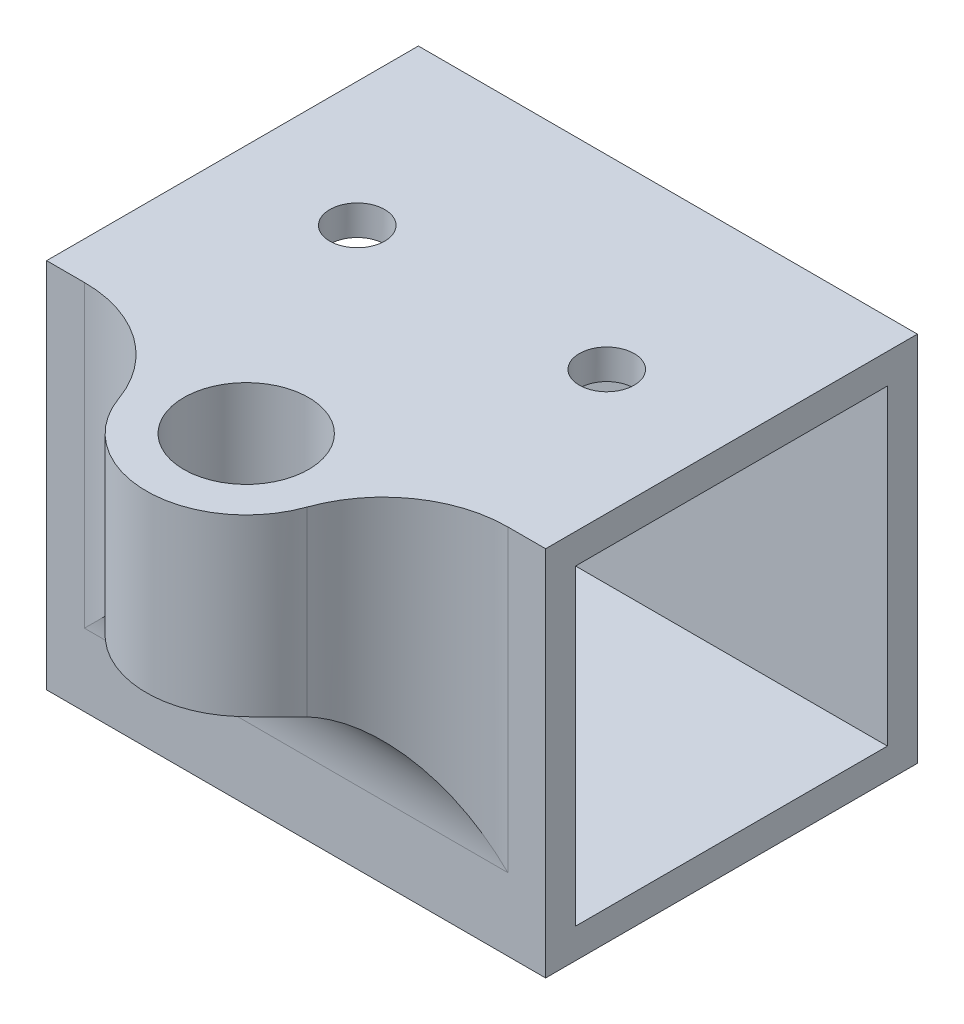
ISO-10303-21;
HEADER;
FILE_DESCRIPTION(('STEP AP214'),'2;1');
FILE_NAME('part.step','',(''),(''),'','','');
FILE_SCHEMA(('AUTOMOTIVE_DESIGN { 1 0 10303 214 1 1 1 1 }'));
ENDSEC;
DATA;
#1=APPLICATION_CONTEXT('core data for automotive mechanical design processes');
#2=APPLICATION_PROTOCOL_DEFINITION('international standard','automotive_design',2000,#1);
#3=PRODUCT_CONTEXT('',#1,'mechanical');
#4=PRODUCT('Part','Part','',(#3));
#5=PRODUCT_RELATED_PRODUCT_CATEGORY('part','',(#4));
#6=PRODUCT_DEFINITION_FORMATION('','',#4);
#7=PRODUCT_DEFINITION_CONTEXT('part definition',#1,'design');
#8=PRODUCT_DEFINITION('design','',#6,#7);
#9=PRODUCT_DEFINITION_SHAPE('','',#8);
#10=(LENGTH_UNIT() NAMED_UNIT(*) SI_UNIT(.MILLI.,.METRE.));
#11=(NAMED_UNIT(*) PLANE_ANGLE_UNIT() SI_UNIT($,.RADIAN.));
#12=(NAMED_UNIT(*) SI_UNIT($,.STERADIAN.) SOLID_ANGLE_UNIT());
#13=UNCERTAINTY_MEASURE_WITH_UNIT(LENGTH_MEASURE(1.E-05),#10,'distance_accuracy_value','');
#14=(GEOMETRIC_REPRESENTATION_CONTEXT(3) GLOBAL_UNCERTAINTY_ASSIGNED_CONTEXT((#13)) GLOBAL_UNIT_ASSIGNED_CONTEXT((#10,
#11,#12)) REPRESENTATION_CONTEXT('',''));
#15=CARTESIAN_POINT('',(0.,0.,0.));
#16=DIRECTION('',(0.,0.,1.));
#17=DIRECTION('',(1.,0.,0.));
#18=AXIS2_PLACEMENT_3D('',#15,#16,#17);
#19=CARTESIAN_POINT('',(40.,0.,14.9));
#20=DIRECTION('',(0.,0.,-1.));
#21=DIRECTION('',(-1.,0.,0.));
#22=AXIS2_PLACEMENT_3D('',#19,#20,#21);
#23=PLANE('',#22);
#24=DIRECTION('',(-1.,0.,0.));
#25=VECTOR('',#24,1.);
#26=CARTESIAN_POINT('',(40.,14.9,14.9));
#27=LINE('',#26,#25);
#28=CARTESIAN_POINT('',(40.,14.9,14.9));
#29=VERTEX_POINT('',#28);
#30=CARTESIAN_POINT('',(36.9705627484771,14.9,14.9));
#31=VERTEX_POINT('',#30);
#32=EDGE_CURVE('E250',#29,#31,#27,.T.);
#33=ORIENTED_EDGE('',*,*,#32,.T.);
#34=DIRECTION('',(0.,1.,0.));
#35=VECTOR('',#34,1.);
#36=CARTESIAN_POINT('',(36.9705627484771,0.,14.9));
#37=LINE('',#36,#35);
#38=CARTESIAN_POINT('',(36.9705627484771,-9.1,14.9));
#39=VERTEX_POINT('',#38);
#40=EDGE_CURVE('E261',#31,#39,#37,.F.);
#41=ORIENTED_EDGE('',*,*,#40,.T.);
#42=DIRECTION('',(-1.,0.,0.));
#43=VECTOR('',#42,1.);
#44=CARTESIAN_POINT('',(40.,-9.1,14.9));
#45=LINE('',#44,#43);
#46=CARTESIAN_POINT('',(3.02943725152286,-9.1,14.9));
#47=VERTEX_POINT('',#46);
#48=EDGE_CURVE('E258',#39,#47,#45,.T.);
#49=ORIENTED_EDGE('',*,*,#48,.T.);
#50=DIRECTION('',(0.,1.,0.));
#51=VECTOR('',#50,1.);
#52=CARTESIAN_POINT('',(3.02943725152286,0.,14.9));
#53=LINE('',#52,#51);
#54=CARTESIAN_POINT('',(3.02943725152286,14.9,14.9));
#55=VERTEX_POINT('',#54);
#56=EDGE_CURVE('E256',#47,#55,#53,.T.);
#57=ORIENTED_EDGE('',*,*,#56,.T.);
#58=CARTESIAN_POINT('',(0.,14.9,14.9));
#59=VERTEX_POINT('',#58);
#60=EDGE_CURVE('E249',#55,#59,#27,.T.);
#61=ORIENTED_EDGE('',*,*,#60,.T.);
#62=DIRECTION('',(0.,-1.,0.));
#63=VECTOR('',#62,1.);
#64=CARTESIAN_POINT('',(0.,0.,14.9));
#65=LINE('',#64,#63);
#66=CARTESIAN_POINT('',(0.,-14.9,14.9));
#67=VERTEX_POINT('',#66);
#68=EDGE_CURVE('E239',#59,#67,#65,.T.);
#69=ORIENTED_EDGE('',*,*,#68,.T.);
#70=DIRECTION('',(-1.,0.,0.));
#71=VECTOR('',#70,1.);
#72=CARTESIAN_POINT('',(40.,-14.9,14.9));
#73=LINE('',#72,#71);
#74=CARTESIAN_POINT('',(40.,-14.9,14.9));
#75=VERTEX_POINT('',#74);
#76=EDGE_CURVE('E246',#75,#67,#73,.T.);
#77=ORIENTED_EDGE('',*,*,#76,.F.);
#78=DIRECTION('',(0.,-1.,0.));
#79=VECTOR('',#78,1.);
#80=CARTESIAN_POINT('',(40.,0.,14.9));
#81=LINE('',#80,#79);
#82=EDGE_CURVE('E229',#29,#75,#81,.T.);
#83=ORIENTED_EDGE('',*,*,#82,.F.);
#84=EDGE_LOOP('',(#33,#41,#49,#57,#61,#69,#77,#83));
#85=FACE_BOUND('',#84,.T.);
#86=ADVANCED_FACE('F59',(#85),#23,.F.);
#87=CARTESIAN_POINT('',(40.,-12.5,12.5));
#88=DIRECTION('',(0.,0.,-1.));
#89=DIRECTION('',(-1.,0.,0.));
#90=AXIS2_PLACEMENT_3D('',#87,#88,#89);
#91=PLANE('',#90);
#92=DIRECTION('',(0.,-1.,0.));
#93=VECTOR('',#92,1.);
#94=CARTESIAN_POINT('',(0.,-12.5,12.5));
#95=LINE('',#94,#93);
#96=CARTESIAN_POINT('',(0.,12.5,12.5));
#97=VERTEX_POINT('',#96);
#98=CARTESIAN_POINT('',(0.,-12.5,12.5));
#99=VERTEX_POINT('',#98);
#100=EDGE_CURVE('E214',#97,#99,#95,.T.);
#101=ORIENTED_EDGE('',*,*,#100,.F.);
#102=DIRECTION('',(-1.,0.,0.));
#103=VECTOR('',#102,1.);
#104=CARTESIAN_POINT('',(40.,12.5,12.5));
#105=LINE('',#104,#103);
#106=CARTESIAN_POINT('',(40.,12.5,12.5));
#107=VERTEX_POINT('',#106);
#108=EDGE_CURVE('E198',#107,#97,#105,.T.);
#109=ORIENTED_EDGE('',*,*,#108,.F.);
#110=DIRECTION('',(0.,-1.,0.));
#111=VECTOR('',#110,1.);
#112=CARTESIAN_POINT('',(40.,-12.5,12.5));
#113=LINE('',#112,#111);
#114=CARTESIAN_POINT('',(40.,-12.5,12.5));
#115=VERTEX_POINT('',#114);
#116=EDGE_CURVE('E203',#107,#115,#113,.T.);
#117=ORIENTED_EDGE('',*,*,#116,.T.);
#118=DIRECTION('',(-1.,0.,0.));
#119=VECTOR('',#118,1.);
#120=CARTESIAN_POINT('',(40.,-12.5,12.5));
#121=LINE('',#120,#119);
#122=EDGE_CURVE('E220',#115,#99,#121,.T.);
#123=ORIENTED_EDGE('',*,*,#122,.T.);
#124=EDGE_LOOP('',(#101,#109,#117,#123));
#125=FACE_BOUND('',#124,.T.);
#126=ADVANCED_FACE('F301',(#125),#91,.T.);
#127=CARTESIAN_POINT('',(40.,0.,0.));
#128=DIRECTION('',(1.,0.,0.));
#129=DIRECTION('',(0.,0.,-1.));
#130=AXIS2_PLACEMENT_3D('',#127,#128,#129);
#131=PLANE('',#130);
#132=DIRECTION('',(0.,1.,0.));
#133=VECTOR('',#132,1.);
#134=CARTESIAN_POINT('',(40.,0.,-14.9));
#135=LINE('',#134,#133);
#136=CARTESIAN_POINT('',(40.,-14.9,-14.9));
#137=VERTEX_POINT('',#136);
#138=CARTESIAN_POINT('',(40.,14.9,-14.9));
#139=VERTEX_POINT('',#138);
#140=EDGE_CURVE('E223',#137,#139,#135,.T.);
#141=ORIENTED_EDGE('',*,*,#140,.T.);
#142=DIRECTION('',(0.,0.,1.));
#143=VECTOR('',#142,1.);
#144=CARTESIAN_POINT('',(40.,14.9,0.));
#145=LINE('',#144,#143);
#146=EDGE_CURVE('E226',#139,#29,#145,.T.);
#147=ORIENTED_EDGE('',*,*,#146,.T.);
#148=ORIENTED_EDGE('',*,*,#82,.T.);
#149=DIRECTION('',(0.,0.,-1.));
#150=VECTOR('',#149,1.);
#151=CARTESIAN_POINT('',(40.,-14.9,0.));
#152=LINE('',#151,#150);
#153=EDGE_CURVE('E231',#75,#137,#152,.T.);
#154=ORIENTED_EDGE('',*,*,#153,.T.);
#155=EDGE_LOOP('',(#141,#147,#148,#154));
#156=FACE_BOUND('',#155,.T.);
#157=DIRECTION('',(0.,0.,1.));
#158=VECTOR('',#157,1.);
#159=CARTESIAN_POINT('',(40.,12.5,12.5));
#160=LINE('',#159,#158);
#161=CARTESIAN_POINT('',(40.,12.5,-12.5));
#162=VERTEX_POINT('',#161);
#163=EDGE_CURVE('E189',#162,#107,#160,.T.);
#164=ORIENTED_EDGE('',*,*,#163,.F.);
#165=DIRECTION('',(0.,1.,0.));
#166=VECTOR('',#165,1.);
#167=CARTESIAN_POINT('',(40.,-12.5,-12.5));
#168=LINE('',#167,#166);
#169=CARTESIAN_POINT('',(40.,-12.5,-12.5));
#170=VERTEX_POINT('',#169);
#171=EDGE_CURVE('E179',#170,#162,#168,.T.);
#172=ORIENTED_EDGE('',*,*,#171,.F.);
#173=DIRECTION('',(0.,0.,-1.));
#174=VECTOR('',#173,1.);
#175=CARTESIAN_POINT('',(40.,-12.5,12.5));
#176=LINE('',#175,#174);
#177=EDGE_CURVE('E205',#115,#170,#176,.T.);
#178=ORIENTED_EDGE('',*,*,#177,.F.);
#179=ORIENTED_EDGE('',*,*,#116,.F.);
#180=EDGE_LOOP('',(#164,#172,#178,#179));
#181=FACE_BOUND('',#180,.T.);
#182=ADVANCED_FACE('F201',(#156,#181),#131,.T.);
#183=CARTESIAN_POINT('',(0.,0.,0.));
#184=DIRECTION('',(1.,0.,0.));
#185=DIRECTION('',(0.,0.,-1.));
#186=AXIS2_PLACEMENT_3D('',#183,#184,#185);
#187=PLANE('',#186);
#188=DIRECTION('',(0.,1.,0.));
#189=VECTOR('',#188,1.);
#190=CARTESIAN_POINT('',(0.,0.,-14.9));
#191=LINE('',#190,#189);
#192=CARTESIAN_POINT('',(0.,-14.9,-14.9));
#193=VERTEX_POINT('',#192);
#194=CARTESIAN_POINT('',(0.,14.9,-14.9));
#195=VERTEX_POINT('',#194);
#196=EDGE_CURVE('E197',#193,#195,#191,.T.);
#197=ORIENTED_EDGE('',*,*,#196,.F.);
#198=DIRECTION('',(0.,0.,-1.));
#199=VECTOR('',#198,1.);
#200=CARTESIAN_POINT('',(0.,-14.9,0.));
#201=LINE('',#200,#199);
#202=EDGE_CURVE('E227',#67,#193,#201,.T.);
#203=ORIENTED_EDGE('',*,*,#202,.F.);
#204=ORIENTED_EDGE('',*,*,#68,.F.);
#205=DIRECTION('',(0.,0.,1.));
#206=VECTOR('',#205,1.);
#207=CARTESIAN_POINT('',(0.,14.9,0.));
#208=LINE('',#207,#206);
#209=EDGE_CURVE('E236',#195,#59,#208,.T.);
#210=ORIENTED_EDGE('',*,*,#209,.F.);
#211=EDGE_LOOP('',(#197,#203,#204,#210));
#212=FACE_BOUND('',#211,.T.);
#213=DIRECTION('',(0.,1.,0.));
#214=VECTOR('',#213,1.);
#215=CARTESIAN_POINT('',(0.,-12.5,-12.5));
#216=LINE('',#215,#214);
#217=CARTESIAN_POINT('',(0.,-12.5,-12.5));
#218=VERTEX_POINT('',#217);
#219=CARTESIAN_POINT('',(0.,12.5,-12.5));
#220=VERTEX_POINT('',#219);
#221=EDGE_CURVE('E210',#218,#220,#216,.T.);
#222=ORIENTED_EDGE('',*,*,#221,.T.);
#223=DIRECTION('',(0.,0.,1.));
#224=VECTOR('',#223,1.);
#225=CARTESIAN_POINT('',(0.,12.5,12.5));
#226=LINE('',#225,#224);
#227=EDGE_CURVE('E196',#220,#97,#226,.T.);
#228=ORIENTED_EDGE('',*,*,#227,.T.);
#229=ORIENTED_EDGE('',*,*,#100,.T.);
#230=DIRECTION('',(0.,0.,-1.));
#231=VECTOR('',#230,1.);
#232=CARTESIAN_POINT('',(0.,-12.5,12.5));
#233=LINE('',#232,#231);
#234=EDGE_CURVE('E190',#99,#218,#233,.T.);
#235=ORIENTED_EDGE('',*,*,#234,.T.);
#236=EDGE_LOOP('',(#222,#228,#229,#235));
#237=FACE_BOUND('',#236,.T.);
#238=ADVANCED_FACE('F313',(#212,#237),#187,.F.);
#239=CARTESIAN_POINT('',(40.,0.,-14.9));
#240=DIRECTION('',(0.,0.,1.));
#241=DIRECTION('',(1.,0.,0.));
#242=AXIS2_PLACEMENT_3D('',#239,#240,#241);
#243=PLANE('',#242);
#244=DIRECTION('',(-1.,0.,0.));
#245=VECTOR('',#244,1.);
#246=CARTESIAN_POINT('',(40.,-14.9,-14.9));
#247=LINE('',#246,#245);
#248=CARTESIAN_POINT('',(31.1910678668302,-14.9,-14.9));
#249=VERTEX_POINT('',#248);
#250=EDGE_CURVE('E243',#137,#249,#247,.T.);
#251=ORIENTED_EDGE('',*,*,#250,.T.);
#252=DIRECTION('',(0.,-1.,0.));
#253=VECTOR('',#252,1.);
#254=CARTESIAN_POINT('',(31.1910678668302,0.,-14.9));
#255=LINE('',#254,#253);
#256=CARTESIAN_POINT('',(31.1910678668302,-10.9,-14.9));
#257=VERTEX_POINT('',#256);
#258=EDGE_CURVE('E337',#249,#257,#255,.F.);
#259=ORIENTED_EDGE('',*,*,#258,.T.);
#260=DIRECTION('',(1.,0.,0.));
#261=VECTOR('',#260,1.);
#262=CARTESIAN_POINT('',(40.,-10.9,-14.9));
#263=LINE('',#262,#261);
#264=CARTESIAN_POINT('',(8.80893213316978,-10.9,-14.9));
#265=VERTEX_POINT('',#264);
#266=EDGE_CURVE('E351',#265,#257,#263,.T.);
#267=ORIENTED_EDGE('',*,*,#266,.F.);
#268=DIRECTION('',(0.,-1.,0.));
#269=VECTOR('',#268,1.);
#270=CARTESIAN_POINT('',(8.80893213316978,0.,-14.9));
#271=LINE('',#270,#269);
#272=CARTESIAN_POINT('',(8.80893213316978,-14.9,-14.9));
#273=VERTEX_POINT('',#272);
#274=EDGE_CURVE('E347',#265,#273,#271,.T.);
#275=ORIENTED_EDGE('',*,*,#274,.T.);
#276=EDGE_CURVE('E233',#273,#193,#247,.T.);
#277=ORIENTED_EDGE('',*,*,#276,.T.);
#278=ORIENTED_EDGE('',*,*,#196,.T.);
#279=DIRECTION('',(-1.,0.,0.));
#280=VECTOR('',#279,1.);
#281=CARTESIAN_POINT('',(40.,14.9,-14.9));
#282=LINE('',#281,#280);
#283=EDGE_CURVE('E253',#139,#195,#282,.T.);
#284=ORIENTED_EDGE('',*,*,#283,.F.);
#285=ORIENTED_EDGE('',*,*,#140,.F.);
#286=EDGE_LOOP('',(#251,#259,#267,#275,#277,#278,#284,#285));
#287=FACE_BOUND('',#286,.T.);
#288=ADVANCED_FACE('F317',(#287),#243,.F.);
#289=CARTESIAN_POINT('',(40.,14.9,0.));
#290=DIRECTION('',(0.,-1.,0.));
#291=DIRECTION('',(0.,0.,-1.));
#292=AXIS2_PLACEMENT_3D('',#289,#290,#291);
#293=PLANE('',#292);
#294=CARTESIAN_POINT('',(10.,14.9,0.));
#295=DIRECTION('',(0.,1.,0.));
#296=DIRECTION('',(0.,0.,1.));
#297=AXIS2_PLACEMENT_3D('',#294,#295,#296);
#298=CIRCLE('',#297,2.2);
#299=CARTESIAN_POINT('',(10.,14.9,2.2));
#300=VERTEX_POINT('',#299);
#301=EDGE_CURVE('E373',#300,#300,#298,.T.);
#302=ORIENTED_EDGE('',*,*,#301,.F.);
#303=EDGE_LOOP('',(#302));
#304=FACE_BOUND('',#303,.T.);
#305=CARTESIAN_POINT('',(30.,14.9,0.));
#306=DIRECTION('',(0.,1.,0.));
#307=DIRECTION('',(0.,0.,1.));
#308=AXIS2_PLACEMENT_3D('',#305,#306,#307);
#309=CIRCLE('',#308,2.2);
#310=CARTESIAN_POINT('',(30.,14.9,2.2));
#311=VERTEX_POINT('',#310);
#312=EDGE_CURVE('E374',#311,#311,#309,.T.);
#313=ORIENTED_EDGE('',*,*,#312,.F.);
#314=EDGE_LOOP('',(#313));
#315=FACE_BOUND('',#314,.T.);
#316=ORIENTED_EDGE('',*,*,#60,.F.);
#317=CARTESIAN_POINT('',(3.02943725152286,14.9,24.9));
#318=DIRECTION('',(0.,-1.,0.));
#319=DIRECTION('',(0.,0.,-1.));
#320=AXIS2_PLACEMENT_3D('',#317,#318,#319);
#321=CIRCLE('',#320,10.);
#322=CARTESIAN_POINT('',(12.4575276673435,14.9,21.5666666666667));
#323=VERTEX_POINT('',#322);
#324=EDGE_CURVE('E400',#55,#323,#321,.T.);
#325=ORIENTED_EDGE('',*,*,#324,.T.);
#326=CARTESIAN_POINT('',(20.,14.9,18.9));
#327=DIRECTION('',(0.,1.,0.));
#328=DIRECTION('',(0.,0.,1.));
#329=AXIS2_PLACEMENT_3D('',#326,#327,#328);
#330=CIRCLE('',#329,8.);
#331=CARTESIAN_POINT('',(27.5424723326565,14.9,21.5666666666667));
#332=VERTEX_POINT('',#331);
#333=EDGE_CURVE('E212',#323,#332,#330,.T.);
#334=ORIENTED_EDGE('',*,*,#333,.T.);
#335=CARTESIAN_POINT('',(36.9705627484771,14.9,24.9));
#336=DIRECTION('',(0.,-1.,0.));
#337=DIRECTION('',(0.,0.,-1.));
#338=AXIS2_PLACEMENT_3D('',#335,#336,#337);
#339=CIRCLE('',#338,10.);
#340=EDGE_CURVE('E398',#332,#31,#339,.T.);
#341=ORIENTED_EDGE('',*,*,#340,.T.);
#342=ORIENTED_EDGE('',*,*,#32,.F.);
#343=ORIENTED_EDGE('',*,*,#146,.F.);
#344=ORIENTED_EDGE('',*,*,#283,.T.);
#345=ORIENTED_EDGE('',*,*,#209,.T.);
#346=EDGE_LOOP('',(#316,#325,#334,#341,#342,#343,#344,#345));
#347=FACE_BOUND('',#346,.T.);
#348=CARTESIAN_POINT('',(20.,14.9,18.9));
#349=DIRECTION('',(0.,1.,0.));
#350=DIRECTION('',(0.,0.,1.));
#351=AXIS2_PLACEMENT_3D('',#348,#349,#350);
#352=CIRCLE('',#351,5.);
#353=CARTESIAN_POINT('',(20.,14.9,23.9));
#354=VERTEX_POINT('',#353);
#355=EDGE_CURVE('E385',#354,#354,#352,.T.);
#356=ORIENTED_EDGE('',*,*,#355,.F.);
#357=EDGE_LOOP('',(#356));
#358=FACE_BOUND('',#357,.T.);
#359=ADVANCED_FACE('F321',(#304,#315,#347,#358),#293,.F.);
#360=CARTESIAN_POINT('',(40.,-14.9,0.));
#361=DIRECTION('',(0.,1.,0.));
#362=DIRECTION('',(0.,0.,1.));
#363=AXIS2_PLACEMENT_3D('',#360,#361,#362);
#364=PLANE('',#363);
#365=ORIENTED_EDGE('',*,*,#276,.F.);
#366=CARTESIAN_POINT('',(8.80893213316978,-14.9,-24.9));
#367=DIRECTION('',(0.,1.,0.));
#368=DIRECTION('',(0.,0.,1.));
#369=AXIS2_PLACEMENT_3D('',#366,#367,#368);
#370=CIRCLE('',#369,10.);
#371=CARTESIAN_POINT('',(17.2870138504654,-14.9,-19.5969696969697));
#372=VERTEX_POINT('',#371);
#373=EDGE_CURVE('E67',#273,#372,#370,.T.);
#374=ORIENTED_EDGE('',*,*,#373,.T.);
#375=CARTESIAN_POINT('',(20.,-14.9,-17.9));
#376=DIRECTION('',(0.,-1.,0.));
#377=DIRECTION('',(0.,0.,-1.));
#378=AXIS2_PLACEMENT_3D('',#375,#376,#377);
#379=CIRCLE('',#378,3.2);
#380=CARTESIAN_POINT('',(22.7129861495346,-14.9,-19.5969696969697));
#381=VERTEX_POINT('',#380);
#382=EDGE_CURVE('E358',#372,#381,#379,.T.);
#383=ORIENTED_EDGE('',*,*,#382,.T.);
#384=CARTESIAN_POINT('',(31.1910678668302,-14.9,-24.9));
#385=DIRECTION('',(0.,1.,0.));
#386=DIRECTION('',(0.,0.,1.));
#387=AXIS2_PLACEMENT_3D('',#384,#385,#386);
#388=CIRCLE('',#387,10.);
#389=EDGE_CURVE('E344',#381,#249,#388,.T.);
#390=ORIENTED_EDGE('',*,*,#389,.T.);
#391=ORIENTED_EDGE('',*,*,#250,.F.);
#392=ORIENTED_EDGE('',*,*,#153,.F.);
#393=ORIENTED_EDGE('',*,*,#76,.T.);
#394=ORIENTED_EDGE('',*,*,#202,.T.);
#395=EDGE_LOOP('',(#365,#374,#383,#390,#391,#392,#393,#394));
#396=FACE_BOUND('',#395,.T.);
#397=CARTESIAN_POINT('',(20.,-14.9,-17.9));
#398=DIRECTION('',(0.,-1.,0.));
#399=DIRECTION('',(0.,0.,-1.));
#400=AXIS2_PLACEMENT_3D('',#397,#398,#399);
#401=CIRCLE('',#400,1.2);
#402=CARTESIAN_POINT('',(20.,-14.9,-19.1));
#403=VERTEX_POINT('',#402);
#404=EDGE_CURVE('E366',#403,#403,#401,.T.);
#405=ORIENTED_EDGE('',*,*,#404,.F.);
#406=EDGE_LOOP('',(#405));
#407=FACE_BOUND('',#406,.T.);
#408=ADVANCED_FACE('F310',(#396,#407),#364,.F.);
#409=CARTESIAN_POINT('',(40.,-12.5,-12.5));
#410=DIRECTION('',(0.,0.,1.));
#411=DIRECTION('',(1.,0.,0.));
#412=AXIS2_PLACEMENT_3D('',#409,#410,#411);
#413=PLANE('',#412);
#414=ORIENTED_EDGE('',*,*,#221,.F.);
#415=DIRECTION('',(-1.,0.,0.));
#416=VECTOR('',#415,1.);
#417=CARTESIAN_POINT('',(40.,-12.5,-12.5));
#418=LINE('',#417,#416);
#419=EDGE_CURVE('E185',#170,#218,#418,.T.);
#420=ORIENTED_EDGE('',*,*,#419,.F.);
#421=ORIENTED_EDGE('',*,*,#171,.T.);
#422=DIRECTION('',(-1.,0.,0.));
#423=VECTOR('',#422,1.);
#424=CARTESIAN_POINT('',(40.,12.5,-12.5));
#425=LINE('',#424,#423);
#426=EDGE_CURVE('E182',#162,#220,#425,.T.);
#427=ORIENTED_EDGE('',*,*,#426,.T.);
#428=EDGE_LOOP('',(#414,#420,#421,#427));
#429=FACE_BOUND('',#428,.T.);
#430=ADVANCED_FACE('F181',(#429),#413,.T.);
#431=CARTESIAN_POINT('',(40.,12.5,12.5));
#432=DIRECTION('',(0.,-1.,0.));
#433=DIRECTION('',(0.,0.,-1.));
#434=AXIS2_PLACEMENT_3D('',#431,#432,#433);
#435=PLANE('',#434);
#436=CARTESIAN_POINT('',(10.,12.5,0.));
#437=DIRECTION('',(0.,-1.,0.));
#438=DIRECTION('',(0.,0.,-1.));
#439=AXIS2_PLACEMENT_3D('',#436,#437,#438);
#440=CIRCLE('',#439,2.2);
#441=CARTESIAN_POINT('',(10.,12.5,-2.2));
#442=VERTEX_POINT('',#441);
#443=EDGE_CURVE('E370',#442,#442,#440,.F.);
#444=ORIENTED_EDGE('',*,*,#443,.T.);
#445=EDGE_LOOP('',(#444));
#446=FACE_BOUND('',#445,.T.);
#447=CARTESIAN_POINT('',(30.,12.5,0.));
#448=DIRECTION('',(0.,-1.,0.));
#449=DIRECTION('',(0.,0.,-1.));
#450=AXIS2_PLACEMENT_3D('',#447,#448,#449);
#451=CIRCLE('',#450,2.2);
#452=CARTESIAN_POINT('',(30.,12.5,-2.2));
#453=VERTEX_POINT('',#452);
#454=EDGE_CURVE('E363',#453,#453,#451,.F.);
#455=ORIENTED_EDGE('',*,*,#454,.T.);
#456=EDGE_LOOP('',(#455));
#457=FACE_BOUND('',#456,.T.);
#458=ORIENTED_EDGE('',*,*,#108,.T.);
#459=ORIENTED_EDGE('',*,*,#227,.F.);
#460=ORIENTED_EDGE('',*,*,#426,.F.);
#461=ORIENTED_EDGE('',*,*,#163,.T.);
#462=EDGE_LOOP('',(#458,#459,#460,#461));
#463=FACE_BOUND('',#462,.T.);
#464=ADVANCED_FACE('F193',(#446,#457,#463),#435,.T.);
#465=CARTESIAN_POINT('',(40.,-12.5,12.5));
#466=DIRECTION('',(0.,1.,0.));
#467=DIRECTION('',(0.,0.,1.));
#468=AXIS2_PLACEMENT_3D('',#465,#466,#467);
#469=PLANE('',#468);
#470=ORIENTED_EDGE('',*,*,#234,.F.);
#471=ORIENTED_EDGE('',*,*,#122,.F.);
#472=ORIENTED_EDGE('',*,*,#177,.T.);
#473=ORIENTED_EDGE('',*,*,#419,.T.);
#474=EDGE_LOOP('',(#470,#471,#472,#473));
#475=FACE_BOUND('',#474,.T.);
#476=ADVANCED_FACE('F296',(#475),#469,.T.);
#477=CARTESIAN_POINT('',(20.,4.9,18.9));
#478=DIRECTION('',(0.,1.,0.));
#479=DIRECTION('',(0.,0.,1.));
#480=AXIS2_PLACEMENT_3D('',#477,#478,#479);
#481=CYLINDRICAL_SURFACE('',#480,5.);
#482=ORIENTED_EDGE('',*,*,#355,.T.);
#483=EDGE_LOOP('',(#482));
#484=FACE_BOUND('',#483,.T.);
#485=CARTESIAN_POINT('',(20.,4.9,18.9));
#486=DIRECTION('',(0.,1.,0.));
#487=DIRECTION('',(0.,0.,1.));
#488=AXIS2_PLACEMENT_3D('',#485,#486,#487);
#489=CIRCLE('',#488,5.);
#490=CARTESIAN_POINT('',(20.,4.9,23.9));
#491=VERTEX_POINT('',#490);
#492=EDGE_CURVE('E387',#491,#491,#489,.T.);
#493=ORIENTED_EDGE('',*,*,#492,.F.);
#494=EDGE_LOOP('',(#493));
#495=FACE_BOUND('',#494,.T.);
#496=ADVANCED_FACE('F293',(#484,#495),#481,.F.);
#497=CARTESIAN_POINT('',(20.,4.9,18.9));
#498=DIRECTION('',(0.,1.,0.));
#499=DIRECTION('',(0.,0.,1.));
#500=AXIS2_PLACEMENT_3D('',#497,#498,#499);
#501=CYLINDRICAL_SURFACE('',#500,8.);
#502=CARTESIAN_POINT('',(25.2915026221292,0.9,24.9));
#503=CARTESIAN_POINT('',(25.4393338849184,0.900006668381349,24.7696641292603));
#504=CARTESIAN_POINT('',(25.5823418367961,0.897452269732671,24.6337951110567));
#505=CARTESIAN_POINT('',(25.8579167131464,0.885964833588245,24.3519316940727));
#506=CARTESIAN_POINT('',(25.9904765552448,0.87702750994713,24.2059305510617));
#507=CARTESIAN_POINT('',(26.2409750611918,0.851834619180923,23.9087005218166));
#508=CARTESIAN_POINT('',(26.359197259514,0.835768426075729,23.7576949238613));
#509=CARTESIAN_POINT('',(26.5839833826595,0.795305818301972,23.4483709322211));
#510=CARTESIAN_POINT('',(26.6905521851308,0.770912906624222,23.2900556378529));
#511=CARTESIAN_POINT('',(26.8680748372285,0.719608831465961,23.0049766312661));
#512=CARTESIAN_POINT('',(26.941549781816,0.694600429354528,22.8794310976049));
#513=CARTESIAN_POINT('',(27.0810585198514,0.638772501453304,22.6255320053927));
#514=CARTESIAN_POINT('',(27.1470929093455,0.607953441671713,22.4971786727532));
#515=CARTESIAN_POINT('',(27.2727823998768,0.539553865687045,22.2358728405707));
#516=CARTESIAN_POINT('',(27.3322869723311,0.501852585907271,22.1028795117078));
#517=CARTESIAN_POINT('',(27.4433548077693,0.419917217330614,21.8355575877681));
#518=CARTESIAN_POINT('',(27.4949162488376,0.375681634305327,21.7012286938522));
#519=CARTESIAN_POINT('',(27.5424723326565,0.328090415820634,21.5666666666667));
#520=B_SPLINE_CURVE_WITH_KNOTS('',3,(#502,#503,#504,#505,#506,#507,#508,#509,#510,#511,#512,
#513,#514,#515,#516,#517,#518,#519),.UNSPECIFIED.,.F.,.F.,(4,2,2,2,2,2,2,2,4),(0.,
0.591161146800863,1.18271963304381,1.75942577381624,2.33588959684208,2.77838055044224,
3.22083603184985,3.67196989403693,4.12320707918848),.UNSPECIFIED.);
#521=CARTESIAN_POINT('',(25.2915026221292,0.9,24.9));
#522=VERTEX_POINT('',#521);
#523=CARTESIAN_POINT('',(27.5424723326565,0.328090415820635,21.5666666666667));
#524=VERTEX_POINT('',#523);
#525=EDGE_CURVE('E277',#522,#524,#520,.T.);
#526=ORIENTED_EDGE('',*,*,#525,.T.);
#527=DIRECTION('',(0.,1.,0.));
#528=VECTOR('',#527,1.);
#529=CARTESIAN_POINT('',(27.5424723326565,4.9,21.5666666666667));
#530=LINE('',#529,#528);
#531=EDGE_CURVE('E267',#524,#332,#530,.T.);
#532=ORIENTED_EDGE('',*,*,#531,.T.);
#533=ORIENTED_EDGE('',*,*,#333,.F.);
#534=DIRECTION('',(0.,1.,0.));
#535=VECTOR('',#534,1.);
#536=CARTESIAN_POINT('',(12.4575276673435,4.9,21.5666666666667));
#537=LINE('',#536,#535);
#538=CARTESIAN_POINT('',(12.4575276673435,0.328090415820635,21.5666666666667));
#539=VERTEX_POINT('',#538);
#540=EDGE_CURVE('E265',#323,#539,#537,.F.);
#541=ORIENTED_EDGE('',*,*,#540,.T.);
#542=CARTESIAN_POINT('',(12.4575276673435,0.328090415820635,21.5666666666667));
#543=CARTESIAN_POINT('',(12.4886629033494,0.359228843805467,21.6547347407889));
#544=CARTESIAN_POINT('',(12.5214981107926,0.388936480024652,21.7426929157829));
#545=CARTESIAN_POINT('',(12.5905788536655,0.445533069349797,21.9181728639496));
#546=CARTESIAN_POINT('',(12.6268242981623,0.472422097572605,22.0056946486931));
#547=CARTESIAN_POINT('',(12.7406527622092,0.548900157646242,22.2671924014364));
#548=CARTESIAN_POINT('',(12.8233618709709,0.594334052560587,22.4401973532897));
#549=CARTESIAN_POINT('',(12.9999597116924,0.673646291710176,22.7774714842437));
#550=CARTESIAN_POINT('',(13.093524858373,0.707780498740298,22.9418508442045));
#551=CARTESIAN_POINT('',(13.2928725954682,0.76674636142593,23.2646838583295));
#552=CARTESIAN_POINT('',(13.3986532328197,0.791579501487772,23.4231384544213));
#553=CARTESIAN_POINT('',(13.6821386486098,0.844019326533653,23.8163815440299));
#554=CARTESIAN_POINT('',(13.8678667320154,0.865899390921127,24.0462520050185));
#555=CARTESIAN_POINT('',(14.1668147537441,0.886940222762086,24.3769253906334));
#556=CARTESIAN_POINT('',(14.2709664272798,0.891980088198649,24.4857760461545));
#557=CARTESIAN_POINT('',(14.4852959956402,0.898508115395669,24.6974732835516));
#558=CARTESIAN_POINT('',(14.5954734481646,0.899996537479909,24.8003203049598));
#559=CARTESIAN_POINT('',(14.7084973778709,0.9,24.9000000000001));
#560=B_SPLINE_CURVE_WITH_KNOTS('',3,(#542,#543,#544,#545,#546,#547,#548,#549,#550,#551,#552,
#553,#554,#555,#556,#557,#558,#559),.UNSPECIFIED.,.F.,.F.,(4,2,2,2,2,2,2,2,4),(0.,
0.295337929753712,0.590667986650343,1.18100576674251,1.75687878425836,2.33265985596035,
3.21895513747914,3.67093381942346,4.12287936993254),.UNSPECIFIED.);
#561=CARTESIAN_POINT('',(14.7084973778708,0.9,24.9));
#562=VERTEX_POINT('',#561);
#563=EDGE_CURVE('E269',#539,#562,#560,.T.);
#564=ORIENTED_EDGE('',*,*,#563,.T.);
#565=CARTESIAN_POINT('',(20.,0.9,18.9));
#566=DIRECTION('',(0.,-1.,0.));
#567=DIRECTION('',(0.,0.,-1.));
#568=AXIS2_PLACEMENT_3D('',#565,#566,#567);
#569=CIRCLE('',#568,8.00000000000001);
#570=EDGE_CURVE('E382',#522,#562,#569,.T.);
#571=ORIENTED_EDGE('',*,*,#570,.F.);
#572=EDGE_LOOP('',(#526,#532,#533,#541,#564,#571));
#573=FACE_BOUND('',#572,.T.);
#574=ADVANCED_FACE('F287',(#573),#501,.T.);
#575=CARTESIAN_POINT('',(20.,0.9,18.9));
#576=DIRECTION('',(0.,-1.,0.));
#577=DIRECTION('',(0.,0.,-1.));
#578=AXIS2_PLACEMENT_3D('',#575,#576,#577);
#579=PLANE('',#578);
#580=ORIENTED_EDGE('',*,*,#570,.T.);
#581=DIRECTION('',(-1.,0.,0.));
#582=VECTOR('',#581,1.);
#583=CARTESIAN_POINT('',(20.,0.9,24.9));
#584=LINE('',#583,#582);
#585=EDGE_CURVE('E263',#562,#522,#584,.F.);
#586=ORIENTED_EDGE('',*,*,#585,.T.);
#587=EDGE_LOOP('',(#580,#586));
#588=FACE_BOUND('',#587,.T.);
#589=ADVANCED_FACE('F292',(#588),#579,.T.);
#590=CARTESIAN_POINT('',(20.,4.9,18.9));
#591=DIRECTION('',(0.,-1.,0.));
#592=DIRECTION('',(0.,0.,-1.));
#593=AXIS2_PLACEMENT_3D('',#590,#591,#592);
#594=PLANE('',#593);
#595=ORIENTED_EDGE('',*,*,#492,.T.);
#596=EDGE_LOOP('',(#595));
#597=FACE_BOUND('',#596,.T.);
#598=ADVANCED_FACE('F446',(#597),#594,.F.);
#599=CARTESIAN_POINT('',(36.9705627484771,4.9,24.9));
#600=DIRECTION('',(0.,1.,0.));
#601=DIRECTION('',(0.,0.,1.));
#602=AXIS2_PLACEMENT_3D('',#599,#600,#601);
#603=CYLINDRICAL_SURFACE('',#602,10.);
#604=ORIENTED_EDGE('',*,*,#531,.F.);
#605=CARTESIAN_POINT('',(36.9705627484771,-9.1,24.9));
#606=DIRECTION('',(0.707106781186547,0.707106781186547,0.));
#607=DIRECTION('',(-0.707106781186547,0.707106781186547,0.));
#608=AXIS2_PLACEMENT_3D('',#605,#606,#607);
#609=ELLIPSE('',#608,14.1421356237309,10.);
#610=EDGE_CURVE('E386',#39,#524,#609,.T.);
#611=ORIENTED_EDGE('',*,*,#610,.F.);
#612=ORIENTED_EDGE('',*,*,#40,.F.);
#613=ORIENTED_EDGE('',*,*,#340,.F.);
#614=EDGE_LOOP('',(#604,#611,#612,#613));
#615=FACE_BOUND('',#614,.T.);
#616=ADVANCED_FACE('F404',(#615),#603,.F.);
#617=CARTESIAN_POINT('',(3.02943725152286,4.9,24.9));
#618=DIRECTION('',(0.,1.,0.));
#619=DIRECTION('',(0.,0.,1.));
#620=AXIS2_PLACEMENT_3D('',#617,#618,#619);
#621=CYLINDRICAL_SURFACE('',#620,10.);
#622=ORIENTED_EDGE('',*,*,#324,.F.);
#623=ORIENTED_EDGE('',*,*,#56,.F.);
#624=CARTESIAN_POINT('',(3.02943725152286,-9.1,24.9));
#625=DIRECTION('',(-0.707106781186547,0.707106781186547,0.));
#626=DIRECTION('',(0.707106781186547,0.707106781186547,0.));
#627=AXIS2_PLACEMENT_3D('',#624,#625,#626);
#628=ELLIPSE('',#627,14.1421356237309,10.);
#629=EDGE_CURVE('E377',#539,#47,#628,.T.);
#630=ORIENTED_EDGE('',*,*,#629,.F.);
#631=ORIENTED_EDGE('',*,*,#540,.F.);
#632=EDGE_LOOP('',(#622,#623,#630,#631));
#633=FACE_BOUND('',#632,.T.);
#634=ADVANCED_FACE('F425',(#633),#621,.F.);
#635=CARTESIAN_POINT('',(40.,-9.1,24.9));
#636=DIRECTION('',(-1.,0.,0.));
#637=DIRECTION('',(0.,0.,1.));
#638=AXIS2_PLACEMENT_3D('',#635,#636,#637);
#639=CYLINDRICAL_SURFACE('',#638,10.);
#640=ORIENTED_EDGE('',*,*,#525,.F.);
#641=ORIENTED_EDGE('',*,*,#585,.F.);
#642=ORIENTED_EDGE('',*,*,#563,.F.);
#643=ORIENTED_EDGE('',*,*,#629,.T.);
#644=ORIENTED_EDGE('',*,*,#48,.F.);
#645=ORIENTED_EDGE('',*,*,#610,.T.);
#646=EDGE_LOOP('',(#640,#641,#642,#643,#644,#645));
#647=FACE_BOUND('',#646,.T.);
#648=ADVANCED_FACE('F283',(#647),#639,.F.);
#649=CARTESIAN_POINT('',(30.,-14.901,0.));
#650=DIRECTION('',(0.,1.,0.));
#651=DIRECTION('',(0.,0.,1.));
#652=AXIS2_PLACEMENT_3D('',#649,#650,#651);
#653=CYLINDRICAL_SURFACE('',#652,2.2);
#654=ORIENTED_EDGE('',*,*,#454,.F.);
#655=EDGE_LOOP('',(#654));
#656=FACE_BOUND('',#655,.T.);
#657=ORIENTED_EDGE('',*,*,#312,.T.);
#658=EDGE_LOOP('',(#657));
#659=FACE_BOUND('',#658,.T.);
#660=ADVANCED_FACE('F435',(#656,#659),#653,.F.);
#661=CARTESIAN_POINT('',(10.,-14.901,0.));
#662=DIRECTION('',(0.,1.,0.));
#663=DIRECTION('',(0.,0.,1.));
#664=AXIS2_PLACEMENT_3D('',#661,#662,#663);
#665=CYLINDRICAL_SURFACE('',#664,2.2);
#666=ORIENTED_EDGE('',*,*,#443,.F.);
#667=EDGE_LOOP('',(#666));
#668=FACE_BOUND('',#667,.T.);
#669=ORIENTED_EDGE('',*,*,#301,.T.);
#670=EDGE_LOOP('',(#669));
#671=FACE_BOUND('',#670,.T.);
#672=ADVANCED_FACE('F440',(#668,#671),#665,.F.);
#673=CARTESIAN_POINT('',(20.,-10.9,-17.9));
#674=DIRECTION('',(0.,-1.,0.));
#675=DIRECTION('',(0.,0.,-1.));
#676=AXIS2_PLACEMENT_3D('',#673,#674,#675);
#677=PLANE('',#676);
#678=CARTESIAN_POINT('',(20.,-10.9,-17.9));
#679=DIRECTION('',(0.,-1.,0.));
#680=DIRECTION('',(0.,0.,-1.));
#681=AXIS2_PLACEMENT_3D('',#678,#679,#680);
#682=CIRCLE('',#681,1.2);
#683=CARTESIAN_POINT('',(20.,-10.9,-19.1));
#684=VERTEX_POINT('',#683);
#685=EDGE_CURVE('E361',#684,#684,#682,.T.);
#686=ORIENTED_EDGE('',*,*,#685,.T.);
#687=EDGE_LOOP('',(#686));
#688=FACE_BOUND('',#687,.T.);
#689=CARTESIAN_POINT('',(20.,-10.9,-17.9));
#690=DIRECTION('',(0.,-1.,0.));
#691=DIRECTION('',(0.,0.,-1.));
#692=AXIS2_PLACEMENT_3D('',#689,#690,#691);
#693=CIRCLE('',#692,3.2);
#694=CARTESIAN_POINT('',(17.2870138504654,-10.9,-19.5969696969697));
#695=VERTEX_POINT('',#694);
#696=CARTESIAN_POINT('',(22.7129861495346,-10.9,-19.5969696969697));
#697=VERTEX_POINT('',#696);
#698=EDGE_CURVE('E360',#695,#697,#693,.T.);
#699=ORIENTED_EDGE('',*,*,#698,.F.);
#700=CARTESIAN_POINT('',(8.80893213316978,-10.9,-24.9));
#701=DIRECTION('',(0.,-1.,0.));
#702=DIRECTION('',(0.,0.,-1.));
#703=AXIS2_PLACEMENT_3D('',#700,#701,#702);
#704=CIRCLE('',#703,10.);
#705=EDGE_CURVE('E12',#695,#265,#704,.T.);
#706=ORIENTED_EDGE('',*,*,#705,.T.);
#707=ORIENTED_EDGE('',*,*,#266,.T.);
#708=CARTESIAN_POINT('',(31.1910678668302,-10.9,-24.9));
#709=DIRECTION('',(0.,-1.,0.));
#710=DIRECTION('',(0.,0.,-1.));
#711=AXIS2_PLACEMENT_3D('',#708,#709,#710);
#712=CIRCLE('',#711,10.);
#713=EDGE_CURVE('E345',#257,#697,#712,.T.);
#714=ORIENTED_EDGE('',*,*,#713,.T.);
#715=EDGE_LOOP('',(#699,#706,#707,#714));
#716=FACE_BOUND('',#715,.T.);
#717=ADVANCED_FACE('F413',(#688,#716),#677,.F.);
#718=CARTESIAN_POINT('',(20.,-10.9,-17.9));
#719=DIRECTION('',(0.,-1.,0.));
#720=DIRECTION('',(0.,0.,-1.));
#721=AXIS2_PLACEMENT_3D('',#718,#719,#720);
#722=CYLINDRICAL_SURFACE('',#721,3.2);
#723=ORIENTED_EDGE('',*,*,#698,.T.);
#724=DIRECTION('',(0.,-1.,0.));
#725=VECTOR('',#724,1.);
#726=CARTESIAN_POINT('',(22.7129861495346,-10.9,-19.5969696969697));
#727=LINE('',#726,#725);
#728=EDGE_CURVE('E74',#697,#381,#727,.T.);
#729=ORIENTED_EDGE('',*,*,#728,.T.);
#730=ORIENTED_EDGE('',*,*,#382,.F.);
#731=DIRECTION('',(0.,-1.,0.));
#732=VECTOR('',#731,1.);
#733=CARTESIAN_POINT('',(17.2870138504654,-10.9,-19.5969696969697));
#734=LINE('',#733,#732);
#735=EDGE_CURVE('E346',#372,#695,#734,.F.);
#736=ORIENTED_EDGE('',*,*,#735,.T.);
#737=EDGE_LOOP('',(#723,#729,#730,#736));
#738=FACE_BOUND('',#737,.T.);
#739=ADVANCED_FACE('F454',(#738),#722,.T.);
#740=CARTESIAN_POINT('',(20.,-10.9,-17.9));
#741=DIRECTION('',(0.,-1.,0.));
#742=DIRECTION('',(0.,0.,-1.));
#743=AXIS2_PLACEMENT_3D('',#740,#741,#742);
#744=CYLINDRICAL_SURFACE('',#743,1.2);
#745=ORIENTED_EDGE('',*,*,#685,.F.);
#746=EDGE_LOOP('',(#745));
#747=FACE_BOUND('',#746,.T.);
#748=ORIENTED_EDGE('',*,*,#404,.T.);
#749=EDGE_LOOP('',(#748));
#750=FACE_BOUND('',#749,.T.);
#751=ADVANCED_FACE('F449',(#747,#750),#744,.F.);
#752=CARTESIAN_POINT('',(31.1910678668302,-10.9,-24.9));
#753=DIRECTION('',(0.,-1.,0.));
#754=DIRECTION('',(0.,0.,-1.));
#755=AXIS2_PLACEMENT_3D('',#752,#753,#754);
#756=CYLINDRICAL_SURFACE('',#755,10.);
#757=ORIENTED_EDGE('',*,*,#389,.F.);
#758=ORIENTED_EDGE('',*,*,#728,.F.);
#759=ORIENTED_EDGE('',*,*,#713,.F.);
#760=ORIENTED_EDGE('',*,*,#258,.F.);
#761=EDGE_LOOP('',(#757,#758,#759,#760));
#762=FACE_BOUND('',#761,.T.);
#763=ADVANCED_FACE('F343',(#762),#756,.F.);
#764=CARTESIAN_POINT('',(8.80893213316978,-10.9,-24.9));
#765=DIRECTION('',(0.,-1.,0.));
#766=DIRECTION('',(0.,0.,-1.));
#767=AXIS2_PLACEMENT_3D('',#764,#765,#766);
#768=CYLINDRICAL_SURFACE('',#767,10.);
#769=ORIENTED_EDGE('',*,*,#705,.F.);
#770=ORIENTED_EDGE('',*,*,#735,.F.);
#771=ORIENTED_EDGE('',*,*,#373,.F.);
#772=ORIENTED_EDGE('',*,*,#274,.F.);
#773=EDGE_LOOP('',(#769,#770,#771,#772));
#774=FACE_BOUND('',#773,.T.);
#775=ADVANCED_FACE('F61',(#774),#768,.F.);
#776=CLOSED_SHELL('',(#86,#126,#182,#238,#288,#359,#408,#430,#464,#476,#496,#574,#589,#598,#616,
#634,#648,#660,#672,#717,#739,#751,#763,#775));
#777=MANIFOLD_SOLID_BREP('B2',#776);
#778=ADVANCED_BREP_SHAPE_REPRESENTATION('',(#18,#777),#14);
#779=SHAPE_DEFINITION_REPRESENTATION(#9,#778);
ENDSEC;
END-ISO-10303-21;
